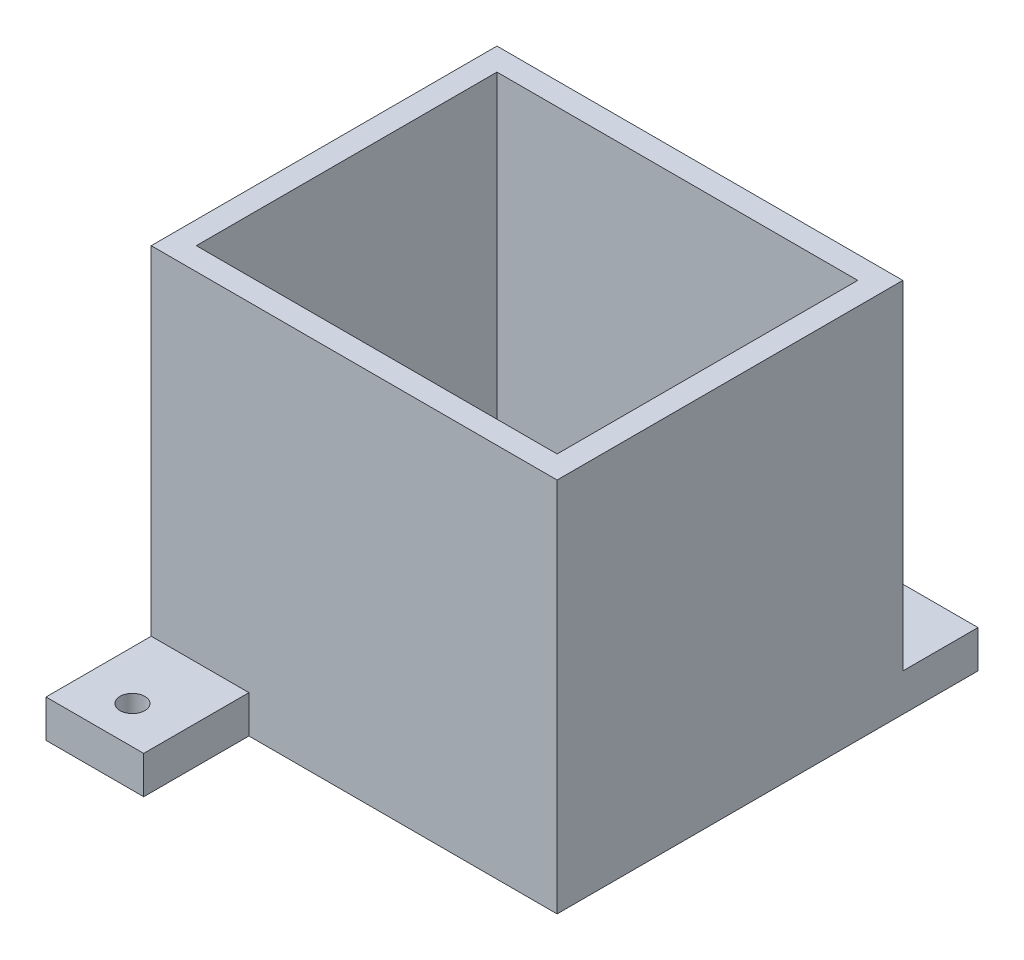
ISO-10303-21;
HEADER;
FILE_DESCRIPTION(('STEP AP214'),'2;1');
FILE_NAME('part.step','',(''),(''),'','','');
FILE_SCHEMA(('AUTOMOTIVE_DESIGN { 1 0 10303 214 1 1 1 1 }'));
ENDSEC;
DATA;
#1=APPLICATION_CONTEXT('core data for automotive mechanical design processes');
#2=APPLICATION_PROTOCOL_DEFINITION('international standard','automotive_design',2000,#1);
#3=PRODUCT_CONTEXT('',#1,'mechanical');
#4=PRODUCT('Part','Part','',(#3));
#5=PRODUCT_RELATED_PRODUCT_CATEGORY('part','',(#4));
#6=PRODUCT_DEFINITION_FORMATION('','',#4);
#7=PRODUCT_DEFINITION_CONTEXT('part definition',#1,'design');
#8=PRODUCT_DEFINITION('design','',#6,#7);
#9=PRODUCT_DEFINITION_SHAPE('','',#8);
#10=(LENGTH_UNIT() NAMED_UNIT(*) SI_UNIT(.MILLI.,.METRE.));
#11=(NAMED_UNIT(*) PLANE_ANGLE_UNIT() SI_UNIT($,.RADIAN.));
#12=(NAMED_UNIT(*) SI_UNIT($,.STERADIAN.) SOLID_ANGLE_UNIT());
#13=UNCERTAINTY_MEASURE_WITH_UNIT(LENGTH_MEASURE(1.E-05),#10,'distance_accuracy_value','');
#14=(GEOMETRIC_REPRESENTATION_CONTEXT(3) GLOBAL_UNCERTAINTY_ASSIGNED_CONTEXT((#13)) GLOBAL_UNIT_ASSIGNED_CONTEXT((#10,
#11,#12)) REPRESENTATION_CONTEXT('',''));
#15=CARTESIAN_POINT('',(0.,0.,0.));
#16=DIRECTION('',(0.,0.,1.));
#17=DIRECTION('',(1.,0.,0.));
#18=AXIS2_PLACEMENT_3D('',#15,#16,#17);
#19=CARTESIAN_POINT('',(0.,50.,-20.439206794203));
#20=DIRECTION('',(0.,0.,-1.));
#21=DIRECTION('',(-1.,0.,0.));
#22=AXIS2_PLACEMENT_3D('',#19,#20,#21);
#23=PLANE('',#22);
#24=DIRECTION('',(1.,0.,0.));
#25=VECTOR('',#24,1.);
#26=CARTESIAN_POINT('',(0.,0.,-20.439206794203));
#27=LINE('',#26,#25);
#28=CARTESIAN_POINT('',(-21.735433127602,0.,-20.439206794203));
#29=VERTEX_POINT('',#28);
#30=CARTESIAN_POINT('',(26.264566872398,0.,-20.439206794203));
#31=VERTEX_POINT('',#30);
#32=EDGE_CURVE('E281',#29,#31,#27,.T.);
#33=ORIENTED_EDGE('',*,*,#32,.T.);
#34=DIRECTION('',(0.,-1.,0.));
#35=VECTOR('',#34,1.);
#36=CARTESIAN_POINT('',(26.264566872398,50.,-20.439206794203));
#37=LINE('',#36,#35);
#38=CARTESIAN_POINT('',(26.264566872398,50.,-20.439206794203));
#39=VERTEX_POINT('',#38);
#40=EDGE_CURVE('E11',#39,#31,#37,.T.);
#41=ORIENTED_EDGE('',*,*,#40,.F.);
#42=DIRECTION('',(1.,0.,0.));
#43=VECTOR('',#42,1.);
#44=CARTESIAN_POINT('',(0.,50.,-20.439206794203));
#45=LINE('',#44,#43);
#46=CARTESIAN_POINT('',(-21.735433127602,50.,-20.439206794203));
#47=VERTEX_POINT('',#46);
#48=EDGE_CURVE('E256',#47,#39,#45,.T.);
#49=ORIENTED_EDGE('',*,*,#48,.F.);
#50=DIRECTION('',(0.,-1.,0.));
#51=VECTOR('',#50,1.);
#52=CARTESIAN_POINT('',(-21.735433127602,50.,-20.439206794203));
#53=LINE('',#52,#51);
#54=EDGE_CURVE('E296',#47,#29,#53,.T.);
#55=ORIENTED_EDGE('',*,*,#54,.T.);
#56=EDGE_LOOP('',(#33,#41,#49,#55));
#57=FACE_BOUND('',#56,.T.);
#58=ADVANCED_FACE('F45',(#57),#23,.F.);
#59=CARTESIAN_POINT('',(26.264566872398,50.,0.));
#60=DIRECTION('',(1.,0.,0.));
#61=DIRECTION('',(0.,0.,-1.));
#62=AXIS2_PLACEMENT_3D('',#59,#60,#61);
#63=PLANE('',#62);
#64=DIRECTION('',(0.,0.,1.));
#65=VECTOR('',#64,1.);
#66=CARTESIAN_POINT('',(26.264566872398,0.,0.));
#67=LINE('',#66,#65);
#68=CARTESIAN_POINT('',(26.264566872398,0.,19.560793205797));
#69=VERTEX_POINT('',#68);
#70=EDGE_CURVE('E285',#31,#69,#67,.T.);
#71=ORIENTED_EDGE('',*,*,#70,.T.);
#72=DIRECTION('',(0.,-1.,0.));
#73=VECTOR('',#72,1.);
#74=CARTESIAN_POINT('',(26.264566872398,50.,19.560793205797));
#75=LINE('',#74,#73);
#76=CARTESIAN_POINT('',(26.264566872398,50.,19.560793205797));
#77=VERTEX_POINT('',#76);
#78=EDGE_CURVE('E55',#77,#69,#75,.T.);
#79=ORIENTED_EDGE('',*,*,#78,.F.);
#80=DIRECTION('',(0.,0.,1.));
#81=VECTOR('',#80,1.);
#82=CARTESIAN_POINT('',(26.264566872398,50.,0.));
#83=LINE('',#82,#81);
#84=EDGE_CURVE('E260',#39,#77,#83,.T.);
#85=ORIENTED_EDGE('',*,*,#84,.F.);
#86=ORIENTED_EDGE('',*,*,#40,.T.);
#87=EDGE_LOOP('',(#71,#79,#85,#86));
#88=FACE_BOUND('',#87,.T.);
#89=ADVANCED_FACE('F349',(#88),#63,.F.);
#90=CARTESIAN_POINT('',(0.,50.,19.560793205797));
#91=DIRECTION('',(0.,0.,-1.));
#92=DIRECTION('',(-1.,0.,0.));
#93=AXIS2_PLACEMENT_3D('',#90,#91,#92);
#94=PLANE('',#93);
#95=DIRECTION('',(1.,0.,0.));
#96=VECTOR('',#95,1.);
#97=CARTESIAN_POINT('',(0.,0.,19.560793205797));
#98=LINE('',#97,#96);
#99=CARTESIAN_POINT('',(-21.735433127602,0.,19.560793205797));
#100=VERTEX_POINT('',#99);
#101=EDGE_CURVE('E289',#100,#69,#98,.T.);
#102=ORIENTED_EDGE('',*,*,#101,.F.);
#103=DIRECTION('',(0.,-1.,0.));
#104=VECTOR('',#103,1.);
#105=CARTESIAN_POINT('',(-21.735433127602,50.,19.560793205797));
#106=LINE('',#105,#104);
#107=CARTESIAN_POINT('',(-21.735433127602,50.,19.560793205797));
#108=VERTEX_POINT('',#107);
#109=EDGE_CURVE('E299',#108,#100,#106,.T.);
#110=ORIENTED_EDGE('',*,*,#109,.F.);
#111=DIRECTION('',(1.,0.,0.));
#112=VECTOR('',#111,1.);
#113=CARTESIAN_POINT('',(0.,50.,19.560793205797));
#114=LINE('',#113,#112);
#115=EDGE_CURVE('E263',#108,#77,#114,.T.);
#116=ORIENTED_EDGE('',*,*,#115,.T.);
#117=ORIENTED_EDGE('',*,*,#78,.T.);
#118=EDGE_LOOP('',(#102,#110,#116,#117));
#119=FACE_BOUND('',#118,.T.);
#120=ADVANCED_FACE('F352',(#119),#94,.T.);
#121=CARTESIAN_POINT('',(29.264566872398,50.,0.));
#122=DIRECTION('',(1.,0.,0.));
#123=DIRECTION('',(0.,0.,-1.));
#124=AXIS2_PLACEMENT_3D('',#121,#122,#123);
#125=PLANE('',#124);
#126=DIRECTION('',(0.,0.,1.));
#127=VECTOR('',#126,1.);
#128=CARTESIAN_POINT('',(29.264566872398,0.,0.));
#129=LINE('',#128,#127);
#130=CARTESIAN_POINT('',(29.264566872398,0.,-33.439206794203));
#131=VERTEX_POINT('',#130);
#132=CARTESIAN_POINT('',(29.264566872398,0.,22.560793205797));
#133=VERTEX_POINT('',#132);
#134=EDGE_CURVE('E240',#131,#133,#129,.T.);
#135=ORIENTED_EDGE('',*,*,#134,.F.);
#136=DIRECTION('',(0.,-1.,0.));
#137=VECTOR('',#136,1.);
#138=CARTESIAN_POINT('',(29.264566872398,5.,-33.439206794203));
#139=LINE('',#138,#137);
#140=CARTESIAN_POINT('',(29.264566872398,5.,-33.439206794203));
#141=VERTEX_POINT('',#140);
#142=EDGE_CURVE('E236',#141,#131,#139,.T.);
#143=ORIENTED_EDGE('',*,*,#142,.F.);
#144=DIRECTION('',(0.,0.,-1.));
#145=VECTOR('',#144,1.);
#146=CARTESIAN_POINT('',(29.264566872398,5.,0.));
#147=LINE('',#146,#145);
#148=CARTESIAN_POINT('',(29.264566872398,5.,-23.439206794203));
#149=VERTEX_POINT('',#148);
#150=EDGE_CURVE('E207',#149,#141,#147,.T.);
#151=ORIENTED_EDGE('',*,*,#150,.F.);
#152=DIRECTION('',(0.,-1.,0.));
#153=VECTOR('',#152,1.);
#154=CARTESIAN_POINT('',(29.264566872398,50.,-23.439206794203));
#155=LINE('',#154,#153);
#156=CARTESIAN_POINT('',(29.264566872398,50.,-23.439206794203));
#157=VERTEX_POINT('',#156);
#158=EDGE_CURVE('E49',#157,#149,#155,.T.);
#159=ORIENTED_EDGE('',*,*,#158,.F.);
#160=DIRECTION('',(0.,0.,1.));
#161=VECTOR('',#160,1.);
#162=CARTESIAN_POINT('',(29.264566872398,50.,0.));
#163=LINE('',#162,#161);
#164=CARTESIAN_POINT('',(29.264566872398,50.,22.560793205797));
#165=VERTEX_POINT('',#164);
#166=EDGE_CURVE('E241',#157,#165,#163,.T.);
#167=ORIENTED_EDGE('',*,*,#166,.T.);
#168=DIRECTION('',(0.,-1.,0.));
#169=VECTOR('',#168,1.);
#170=CARTESIAN_POINT('',(29.264566872398,50.,22.560793205797));
#171=LINE('',#170,#169);
#172=EDGE_CURVE('E271',#165,#133,#171,.T.);
#173=ORIENTED_EDGE('',*,*,#172,.T.);
#174=EDGE_LOOP('',(#135,#143,#151,#159,#167,#173));
#175=FACE_BOUND('',#174,.T.);
#176=ADVANCED_FACE('F47',(#175),#125,.T.);
#177=CARTESIAN_POINT('',(0.,50.,-23.439206794203));
#178=DIRECTION('',(0.,0.,-1.));
#179=DIRECTION('',(-1.,0.,0.));
#180=AXIS2_PLACEMENT_3D('',#177,#178,#179);
#181=PLANE('',#180);
#182=DIRECTION('',(1.,0.,0.));
#183=VECTOR('',#182,1.);
#184=CARTESIAN_POINT('',(0.,5.,-23.439206794203));
#185=LINE('',#184,#183);
#186=CARTESIAN_POINT('',(-24.735433127602,5.,-23.439206794203));
#187=VERTEX_POINT('',#186);
#188=EDGE_CURVE('E71',#187,#149,#185,.T.);
#189=ORIENTED_EDGE('',*,*,#188,.F.);
#190=DIRECTION('',(0.,-1.,0.));
#191=VECTOR('',#190,1.);
#192=CARTESIAN_POINT('',(-24.735433127602,50.,-23.439206794203));
#193=LINE('',#192,#191);
#194=CARTESIAN_POINT('',(-24.735433127602,50.,-23.439206794203));
#195=VERTEX_POINT('',#194);
#196=EDGE_CURVE('E308',#195,#187,#193,.T.);
#197=ORIENTED_EDGE('',*,*,#196,.F.);
#198=DIRECTION('',(1.,0.,0.));
#199=VECTOR('',#198,1.);
#200=CARTESIAN_POINT('',(0.,50.,-23.439206794203));
#201=LINE('',#200,#199);
#202=EDGE_CURVE('E245',#195,#157,#201,.T.);
#203=ORIENTED_EDGE('',*,*,#202,.T.);
#204=ORIENTED_EDGE('',*,*,#158,.T.);
#205=EDGE_LOOP('',(#189,#197,#203,#204));
#206=FACE_BOUND('',#205,.T.);
#207=ADVANCED_FACE('F315',(#206),#181,.T.);
#208=CARTESIAN_POINT('',(-24.735433127602,50.,0.));
#209=DIRECTION('',(1.,0.,0.));
#210=DIRECTION('',(0.,0.,-1.));
#211=AXIS2_PLACEMENT_3D('',#208,#209,#210);
#212=PLANE('',#211);
#213=DIRECTION('',(0.,0.,1.));
#214=VECTOR('',#213,1.);
#215=CARTESIAN_POINT('',(-24.735433127602,0.,0.));
#216=LINE('',#215,#214);
#217=CARTESIAN_POINT('',(-24.735433127602,0.,-33.439206794203));
#218=VERTEX_POINT('',#217);
#219=CARTESIAN_POINT('',(-24.735433127602,0.,36.560793205797));
#220=VERTEX_POINT('',#219);
#221=EDGE_CURVE('E275',#218,#220,#216,.T.);
#222=ORIENTED_EDGE('',*,*,#221,.T.);
#223=DIRECTION('',(0.,-1.,0.));
#224=VECTOR('',#223,1.);
#225=CARTESIAN_POINT('',(-24.735433127602,5.,36.560793205797));
#226=LINE('',#225,#224);
#227=CARTESIAN_POINT('',(-24.735433127602,5.,36.560793205797));
#228=VERTEX_POINT('',#227);
#229=EDGE_CURVE('E150',#228,#220,#226,.T.);
#230=ORIENTED_EDGE('',*,*,#229,.F.);
#231=DIRECTION('',(0.,0.,1.));
#232=VECTOR('',#231,1.);
#233=CARTESIAN_POINT('',(-24.735433127602,5.,0.));
#234=LINE('',#233,#232);
#235=CARTESIAN_POINT('',(-24.735433127602,5.,22.560793205797));
#236=VERTEX_POINT('',#235);
#237=EDGE_CURVE('E168',#236,#228,#234,.T.);
#238=ORIENTED_EDGE('',*,*,#237,.F.);
#239=DIRECTION('',(0.,-1.,0.));
#240=VECTOR('',#239,1.);
#241=CARTESIAN_POINT('',(-24.735433127602,50.,22.560793205797));
#242=LINE('',#241,#240);
#243=CARTESIAN_POINT('',(-24.735433127602,50.,22.560793205797));
#244=VERTEX_POINT('',#243);
#245=EDGE_CURVE('E166',#244,#236,#242,.T.);
#246=ORIENTED_EDGE('',*,*,#245,.F.);
#247=DIRECTION('',(0.,0.,1.));
#248=VECTOR('',#247,1.);
#249=CARTESIAN_POINT('',(-24.735433127602,50.,0.));
#250=LINE('',#249,#248);
#251=EDGE_CURVE('E250',#195,#244,#250,.T.);
#252=ORIENTED_EDGE('',*,*,#251,.F.);
#253=ORIENTED_EDGE('',*,*,#196,.T.);
#254=DIRECTION('',(0.,0.,-1.));
#255=VECTOR('',#254,1.);
#256=CARTESIAN_POINT('',(-24.735433127602,5.,0.));
#257=LINE('',#256,#255);
#258=CARTESIAN_POINT('',(-24.735433127602,5.,-33.439206794203));
#259=VERTEX_POINT('',#258);
#260=EDGE_CURVE('E214',#187,#259,#257,.T.);
#261=ORIENTED_EDGE('',*,*,#260,.T.);
#262=DIRECTION('',(0.,-1.,0.));
#263=VECTOR('',#262,1.);
#264=CARTESIAN_POINT('',(-24.735433127602,5.,-33.439206794203));
#265=LINE('',#264,#263);
#266=EDGE_CURVE('E218',#259,#218,#265,.T.);
#267=ORIENTED_EDGE('',*,*,#266,.T.);
#268=EDGE_LOOP('',(#222,#230,#238,#246,#252,#253,#261,#267));
#269=FACE_BOUND('',#268,.T.);
#270=ADVANCED_FACE('F323',(#269),#212,.F.);
#271=CARTESIAN_POINT('',(0.,50.,22.560793205797));
#272=DIRECTION('',(0.,0.,-1.));
#273=DIRECTION('',(-1.,0.,0.));
#274=AXIS2_PLACEMENT_3D('',#271,#272,#273);
#275=PLANE('',#274);
#276=ORIENTED_EDGE('',*,*,#245,.T.);
#277=DIRECTION('',(1.,0.,0.));
#278=VECTOR('',#277,1.);
#279=CARTESIAN_POINT('',(0.,5.,22.560793205797));
#280=LINE('',#279,#278);
#281=CARTESIAN_POINT('',(-11.735433127602,5.,22.560793205797));
#282=VERTEX_POINT('',#281);
#283=EDGE_CURVE('E156',#236,#282,#280,.T.);
#284=ORIENTED_EDGE('',*,*,#283,.T.);
#285=DIRECTION('',(0.,-1.,0.));
#286=VECTOR('',#285,1.);
#287=CARTESIAN_POINT('',(-11.735433127602,5.,22.560793205797));
#288=LINE('',#287,#286);
#289=CARTESIAN_POINT('',(-11.735433127602,0.,22.560793205797));
#290=VERTEX_POINT('',#289);
#291=EDGE_CURVE('E141',#282,#290,#288,.T.);
#292=ORIENTED_EDGE('',*,*,#291,.T.);
#293=DIRECTION('',(1.,0.,0.));
#294=VECTOR('',#293,1.);
#295=CARTESIAN_POINT('',(0.,0.,22.560793205797));
#296=LINE('',#295,#294);
#297=EDGE_CURVE('E278',#290,#133,#296,.T.);
#298=ORIENTED_EDGE('',*,*,#297,.T.);
#299=ORIENTED_EDGE('',*,*,#172,.F.);
#300=DIRECTION('',(1.,0.,0.));
#301=VECTOR('',#300,1.);
#302=CARTESIAN_POINT('',(0.,50.,22.560793205797));
#303=LINE('',#302,#301);
#304=EDGE_CURVE('E253',#244,#165,#303,.T.);
#305=ORIENTED_EDGE('',*,*,#304,.F.);
#306=EDGE_LOOP('',(#276,#284,#292,#298,#299,#305));
#307=FACE_BOUND('',#306,.T.);
#308=ADVANCED_FACE('F163',(#307),#275,.F.);
#309=CARTESIAN_POINT('',(-21.735433127602,50.,0.));
#310=DIRECTION('',(1.,0.,0.));
#311=DIRECTION('',(0.,0.,-1.));
#312=AXIS2_PLACEMENT_3D('',#309,#310,#311);
#313=PLANE('',#312);
#314=DIRECTION('',(0.,0.,1.));
#315=VECTOR('',#314,1.);
#316=CARTESIAN_POINT('',(-21.735433127602,0.,0.));
#317=LINE('',#316,#315);
#318=EDGE_CURVE('E246',#29,#100,#317,.T.);
#319=ORIENTED_EDGE('',*,*,#318,.F.);
#320=ORIENTED_EDGE('',*,*,#54,.F.);
#321=DIRECTION('',(0.,0.,1.));
#322=VECTOR('',#321,1.);
#323=CARTESIAN_POINT('',(-21.735433127602,50.,0.));
#324=LINE('',#323,#322);
#325=EDGE_CURVE('E267',#47,#108,#324,.T.);
#326=ORIENTED_EDGE('',*,*,#325,.T.);
#327=ORIENTED_EDGE('',*,*,#109,.T.);
#328=EDGE_LOOP('',(#319,#320,#326,#327));
#329=FACE_BOUND('',#328,.T.);
#330=ADVANCED_FACE('F339',(#329),#313,.T.);
#331=CARTESIAN_POINT('',(0.,50.,0.));
#332=DIRECTION('',(0.,1.,0.));
#333=DIRECTION('',(0.,0.,1.));
#334=AXIS2_PLACEMENT_3D('',#331,#332,#333);
#335=PLANE('',#334);
#336=ORIENTED_EDGE('',*,*,#166,.F.);
#337=ORIENTED_EDGE('',*,*,#202,.F.);
#338=ORIENTED_EDGE('',*,*,#251,.T.);
#339=ORIENTED_EDGE('',*,*,#304,.T.);
#340=EDGE_LOOP('',(#336,#337,#338,#339));
#341=FACE_BOUND('',#340,.T.);
#342=ORIENTED_EDGE('',*,*,#48,.T.);
#343=ORIENTED_EDGE('',*,*,#84,.T.);
#344=ORIENTED_EDGE('',*,*,#115,.F.);
#345=ORIENTED_EDGE('',*,*,#325,.F.);
#346=EDGE_LOOP('',(#342,#343,#344,#345));
#347=FACE_BOUND('',#346,.T.);
#348=ADVANCED_FACE('F336',(#341,#347),#335,.T.);
#349=CARTESIAN_POINT('',(0.,0.,0.));
#350=DIRECTION('',(0.,1.,0.));
#351=DIRECTION('',(0.,0.,1.));
#352=AXIS2_PLACEMENT_3D('',#349,#350,#351);
#353=PLANE('',#352);
#354=ORIENTED_EDGE('',*,*,#134,.T.);
#355=ORIENTED_EDGE('',*,*,#297,.F.);
#356=DIRECTION('',(0.,0.,1.));
#357=VECTOR('',#356,1.);
#358=CARTESIAN_POINT('',(-11.735433127602,0.,0.));
#359=LINE('',#358,#357);
#360=CARTESIAN_POINT('',(-11.735433127602,0.,36.560793205797));
#361=VERTEX_POINT('',#360);
#362=EDGE_CURVE('E63',#290,#361,#359,.T.);
#363=ORIENTED_EDGE('',*,*,#362,.T.);
#364=DIRECTION('',(1.,0.,0.));
#365=VECTOR('',#364,1.);
#366=CARTESIAN_POINT('',(0.,0.,36.560793205797));
#367=LINE('',#366,#365);
#368=EDGE_CURVE('E183',#220,#361,#367,.T.);
#369=ORIENTED_EDGE('',*,*,#368,.F.);
#370=ORIENTED_EDGE('',*,*,#221,.F.);
#371=DIRECTION('',(1.,0.,0.));
#372=VECTOR('',#371,1.);
#373=CARTESIAN_POINT('',(0.,0.,-33.439206794203));
#374=LINE('',#373,#372);
#375=EDGE_CURVE('E197',#218,#131,#374,.T.);
#376=ORIENTED_EDGE('',*,*,#375,.T.);
#377=EDGE_LOOP('',(#354,#355,#363,#369,#370,#376));
#378=FACE_BOUND('',#377,.T.);
#379=ORIENTED_EDGE('',*,*,#32,.F.);
#380=ORIENTED_EDGE('',*,*,#318,.T.);
#381=ORIENTED_EDGE('',*,*,#101,.T.);
#382=ORIENTED_EDGE('',*,*,#70,.F.);
#383=EDGE_LOOP('',(#379,#380,#381,#382));
#384=FACE_BOUND('',#383,.T.);
#385=CARTESIAN_POINT('',(-18.235433127602,0.,-28.4392067942027));
#386=DIRECTION('',(0.,1.,0.));
#387=DIRECTION('',(0.,0.,1.));
#388=AXIS2_PLACEMENT_3D('',#385,#386,#387);
#389=CIRCLE('',#388,1.65);
#390=CARTESIAN_POINT('',(-18.235433127602,0.,-26.7892067942027));
#391=VERTEX_POINT('',#390);
#392=EDGE_CURVE('E149',#391,#391,#389,.T.);
#393=ORIENTED_EDGE('',*,*,#392,.T.);
#394=EDGE_LOOP('',(#393));
#395=FACE_BOUND('',#394,.T.);
#396=CARTESIAN_POINT('',(1.76456687239801,0.,-28.4392067942028));
#397=DIRECTION('',(0.,1.,0.));
#398=DIRECTION('',(0.,0.,1.));
#399=AXIS2_PLACEMENT_3D('',#396,#397,#398);
#400=CIRCLE('',#399,1.65);
#401=CARTESIAN_POINT('',(1.76456687239801,0.,-26.7892067942028));
#402=VERTEX_POINT('',#401);
#403=EDGE_CURVE('E222',#402,#402,#400,.T.);
#404=ORIENTED_EDGE('',*,*,#403,.T.);
#405=EDGE_LOOP('',(#404));
#406=FACE_BOUND('',#405,.T.);
#407=CARTESIAN_POINT('',(21.764566872398,0.,-28.439206794203));
#408=DIRECTION('',(0.,1.,0.));
#409=DIRECTION('',(0.,0.,1.));
#410=AXIS2_PLACEMENT_3D('',#407,#408,#409);
#411=CIRCLE('',#410,1.65);
#412=CARTESIAN_POINT('',(21.764566872398,0.,-26.789206794203));
#413=VERTEX_POINT('',#412);
#414=EDGE_CURVE('E226',#413,#413,#411,.T.);
#415=ORIENTED_EDGE('',*,*,#414,.T.);
#416=EDGE_LOOP('',(#415));
#417=FACE_BOUND('',#416,.T.);
#418=CARTESIAN_POINT('',(-18.235433127602,0.,31.560793205797));
#419=DIRECTION('',(0.,1.,0.));
#420=DIRECTION('',(0.,0.,1.));
#421=AXIS2_PLACEMENT_3D('',#418,#419,#420);
#422=CIRCLE('',#421,1.65);
#423=CARTESIAN_POINT('',(-18.235433127602,0.,33.210793205797));
#424=VERTEX_POINT('',#423);
#425=EDGE_CURVE('E177',#424,#424,#422,.T.);
#426=ORIENTED_EDGE('',*,*,#425,.T.);
#427=EDGE_LOOP('',(#426));
#428=FACE_BOUND('',#427,.T.);
#429=ADVANCED_FACE('F330',(#378,#384,#395,#406,#417,#428),#353,.F.);
#430=CARTESIAN_POINT('',(0.,5.,-33.439206794203));
#431=DIRECTION('',(0.,0.,-1.));
#432=DIRECTION('',(-1.,0.,0.));
#433=AXIS2_PLACEMENT_3D('',#430,#431,#432);
#434=PLANE('',#433);
#435=ORIENTED_EDGE('',*,*,#375,.F.);
#436=ORIENTED_EDGE('',*,*,#266,.F.);
#437=DIRECTION('',(1.,0.,0.));
#438=VECTOR('',#437,1.);
#439=CARTESIAN_POINT('',(0.,5.,-33.439206794203));
#440=LINE('',#439,#438);
#441=EDGE_CURVE('E210',#259,#141,#440,.T.);
#442=ORIENTED_EDGE('',*,*,#441,.T.);
#443=ORIENTED_EDGE('',*,*,#142,.T.);
#444=EDGE_LOOP('',(#435,#436,#442,#443));
#445=FACE_BOUND('',#444,.T.);
#446=ADVANCED_FACE('F328',(#445),#434,.T.);
#447=CARTESIAN_POINT('',(21.764566872398,5.,-28.439206794203));
#448=DIRECTION('',(0.,-1.,0.));
#449=DIRECTION('',(0.,0.,-1.));
#450=AXIS2_PLACEMENT_3D('',#447,#448,#449);
#451=CYLINDRICAL_SURFACE('',#450,1.65);
#452=CARTESIAN_POINT('',(21.764566872398,5.,-28.439206794203));
#453=DIRECTION('',(0.,1.,0.));
#454=DIRECTION('',(0.,0.,1.));
#455=AXIS2_PLACEMENT_3D('',#452,#453,#454);
#456=CIRCLE('',#455,1.65);
#457=CARTESIAN_POINT('',(21.764566872398,5.,-26.789206794203));
#458=VERTEX_POINT('',#457);
#459=EDGE_CURVE('E201',#458,#458,#456,.T.);
#460=ORIENTED_EDGE('',*,*,#459,.T.);
#461=EDGE_LOOP('',(#460));
#462=FACE_BOUND('',#461,.T.);
#463=ORIENTED_EDGE('',*,*,#414,.F.);
#464=EDGE_LOOP('',(#463));
#465=FACE_BOUND('',#464,.T.);
#466=ADVANCED_FACE('F409',(#462,#465),#451,.F.);
#467=CARTESIAN_POINT('',(1.76456687239801,5.,-28.4392067942028));
#468=DIRECTION('',(0.,-1.,0.));
#469=DIRECTION('',(0.,0.,-1.));
#470=AXIS2_PLACEMENT_3D('',#467,#468,#469);
#471=CYLINDRICAL_SURFACE('',#470,1.65);
#472=CARTESIAN_POINT('',(1.76456687239801,5.,-28.4392067942028));
#473=DIRECTION('',(0.,1.,0.));
#474=DIRECTION('',(0.,0.,1.));
#475=AXIS2_PLACEMENT_3D('',#472,#473,#474);
#476=CIRCLE('',#475,1.65);
#477=CARTESIAN_POINT('',(1.76456687239801,5.,-26.7892067942028));
#478=VERTEX_POINT('',#477);
#479=EDGE_CURVE('E196',#478,#478,#476,.T.);
#480=ORIENTED_EDGE('',*,*,#479,.T.);
#481=EDGE_LOOP('',(#480));
#482=FACE_BOUND('',#481,.T.);
#483=ORIENTED_EDGE('',*,*,#403,.F.);
#484=EDGE_LOOP('',(#483));
#485=FACE_BOUND('',#484,.T.);
#486=ADVANCED_FACE('F405',(#482,#485),#471,.F.);
#487=CARTESIAN_POINT('',(-18.235433127602,5.,-28.4392067942027));
#488=DIRECTION('',(0.,-1.,0.));
#489=DIRECTION('',(0.,0.,-1.));
#490=AXIS2_PLACEMENT_3D('',#487,#488,#489);
#491=CYLINDRICAL_SURFACE('',#490,1.65);
#492=CARTESIAN_POINT('',(-18.235433127602,5.,-28.4392067942027));
#493=DIRECTION('',(0.,1.,0.));
#494=DIRECTION('',(0.,0.,1.));
#495=AXIS2_PLACEMENT_3D('',#492,#493,#494);
#496=CIRCLE('',#495,1.65);
#497=CARTESIAN_POINT('',(-18.235433127602,5.,-26.7892067942027));
#498=VERTEX_POINT('',#497);
#499=EDGE_CURVE('E192',#498,#498,#496,.T.);
#500=ORIENTED_EDGE('',*,*,#499,.T.);
#501=EDGE_LOOP('',(#500));
#502=FACE_BOUND('',#501,.T.);
#503=ORIENTED_EDGE('',*,*,#392,.F.);
#504=EDGE_LOOP('',(#503));
#505=FACE_BOUND('',#504,.T.);
#506=ADVANCED_FACE('F402',(#502,#505),#491,.F.);
#507=CARTESIAN_POINT('',(0.,5.,0.));
#508=DIRECTION('',(0.,1.,0.));
#509=DIRECTION('',(0.,0.,1.));
#510=AXIS2_PLACEMENT_3D('',#507,#508,#509);
#511=PLANE('',#510);
#512=ORIENTED_EDGE('',*,*,#499,.F.);
#513=EDGE_LOOP('',(#512));
#514=FACE_BOUND('',#513,.T.);
#515=ORIENTED_EDGE('',*,*,#479,.F.);
#516=EDGE_LOOP('',(#515));
#517=FACE_BOUND('',#516,.T.);
#518=ORIENTED_EDGE('',*,*,#459,.F.);
#519=EDGE_LOOP('',(#518));
#520=FACE_BOUND('',#519,.T.);
#521=ORIENTED_EDGE('',*,*,#188,.T.);
#522=ORIENTED_EDGE('',*,*,#150,.T.);
#523=ORIENTED_EDGE('',*,*,#441,.F.);
#524=ORIENTED_EDGE('',*,*,#260,.F.);
#525=EDGE_LOOP('',(#521,#522,#523,#524));
#526=FACE_BOUND('',#525,.T.);
#527=ADVANCED_FACE('F322',(#514,#517,#520,#526),#511,.T.);
#528=CARTESIAN_POINT('',(-11.735433127602,5.,0.));
#529=DIRECTION('',(1.,0.,0.));
#530=DIRECTION('',(0.,0.,-1.));
#531=AXIS2_PLACEMENT_3D('',#528,#529,#530);
#532=PLANE('',#531);
#533=ORIENTED_EDGE('',*,*,#362,.F.);
#534=ORIENTED_EDGE('',*,*,#291,.F.);
#535=DIRECTION('',(0.,0.,1.));
#536=VECTOR('',#535,1.);
#537=CARTESIAN_POINT('',(-11.735433127602,5.,0.));
#538=LINE('',#537,#536);
#539=CARTESIAN_POINT('',(-11.735433127602,5.,36.560793205797));
#540=VERTEX_POINT('',#539);
#541=EDGE_CURVE('E144',#282,#540,#538,.T.);
#542=ORIENTED_EDGE('',*,*,#541,.T.);
#543=DIRECTION('',(0.,-1.,0.));
#544=VECTOR('',#543,1.);
#545=CARTESIAN_POINT('',(-11.735433127602,5.,36.560793205797));
#546=LINE('',#545,#544);
#547=EDGE_CURVE('E176',#540,#361,#546,.T.);
#548=ORIENTED_EDGE('',*,*,#547,.T.);
#549=EDGE_LOOP('',(#533,#534,#542,#548));
#550=FACE_BOUND('',#549,.T.);
#551=ADVANCED_FACE('F143',(#550),#532,.T.);
#552=CARTESIAN_POINT('',(-18.235433127602,5.,31.560793205797));
#553=DIRECTION('',(0.,-1.,0.));
#554=DIRECTION('',(0.,0.,-1.));
#555=AXIS2_PLACEMENT_3D('',#552,#553,#554);
#556=CYLINDRICAL_SURFACE('',#555,1.65);
#557=CARTESIAN_POINT('',(-18.235433127602,5.,31.560793205797));
#558=DIRECTION('',(0.,1.,0.));
#559=DIRECTION('',(0.,0.,1.));
#560=AXIS2_PLACEMENT_3D('',#557,#558,#559);
#561=CIRCLE('',#560,1.65);
#562=CARTESIAN_POINT('',(-18.235433127602,5.,33.210793205797));
#563=VERTEX_POINT('',#562);
#564=EDGE_CURVE('E161',#563,#563,#561,.T.);
#565=ORIENTED_EDGE('',*,*,#564,.T.);
#566=EDGE_LOOP('',(#565));
#567=FACE_BOUND('',#566,.T.);
#568=ORIENTED_EDGE('',*,*,#425,.F.);
#569=EDGE_LOOP('',(#568));
#570=FACE_BOUND('',#569,.T.);
#571=ADVANCED_FACE('F366',(#567,#570),#556,.F.);
#572=CARTESIAN_POINT('',(0.,5.,36.560793205797));
#573=DIRECTION('',(0.,0.,-1.));
#574=DIRECTION('',(-1.,0.,0.));
#575=AXIS2_PLACEMENT_3D('',#572,#573,#574);
#576=PLANE('',#575);
#577=ORIENTED_EDGE('',*,*,#368,.T.);
#578=ORIENTED_EDGE('',*,*,#547,.F.);
#579=DIRECTION('',(1.,0.,0.));
#580=VECTOR('',#579,1.);
#581=CARTESIAN_POINT('',(0.,5.,36.560793205797));
#582=LINE('',#581,#580);
#583=EDGE_CURVE('E158',#228,#540,#582,.T.);
#584=ORIENTED_EDGE('',*,*,#583,.F.);
#585=ORIENTED_EDGE('',*,*,#229,.T.);
#586=EDGE_LOOP('',(#577,#578,#584,#585));
#587=FACE_BOUND('',#586,.T.);
#588=ADVANCED_FACE('F333',(#587),#576,.F.);
#589=CARTESIAN_POINT('',(0.,5.,0.));
#590=DIRECTION('',(0.,1.,0.));
#591=DIRECTION('',(0.,0.,1.));
#592=AXIS2_PLACEMENT_3D('',#589,#590,#591);
#593=PLANE('',#592);
#594=ORIENTED_EDGE('',*,*,#564,.F.);
#595=EDGE_LOOP('',(#594));
#596=FACE_BOUND('',#595,.T.);
#597=ORIENTED_EDGE('',*,*,#541,.F.);
#598=ORIENTED_EDGE('',*,*,#283,.F.);
#599=ORIENTED_EDGE('',*,*,#237,.T.);
#600=ORIENTED_EDGE('',*,*,#583,.T.);
#601=EDGE_LOOP('',(#597,#598,#599,#600));
#602=FACE_BOUND('',#601,.T.);
#603=ADVANCED_FACE('F154',(#596,#602),#593,.T.);
#604=CLOSED_SHELL('',(#58,#89,#120,#176,#207,#270,#308,#330,#348,#429,#446,#466,#486,#506,#527,
#551,#571,#588,#603));
#605=MANIFOLD_SOLID_BREP('B2',#604);
#606=ADVANCED_BREP_SHAPE_REPRESENTATION('',(#18,#605),#14);
#607=SHAPE_DEFINITION_REPRESENTATION(#9,#606);
ENDSEC;
END-ISO-10303-21;
